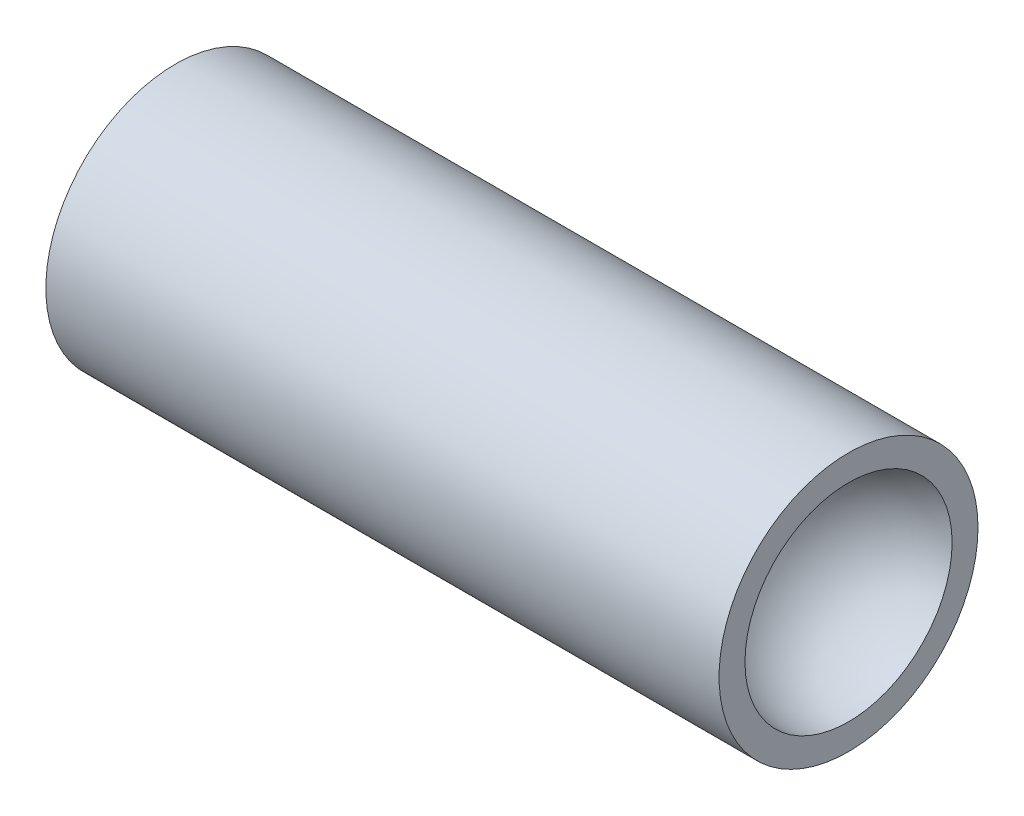
ISO-10303-21;
HEADER;
FILE_DESCRIPTION(('STEP AP214'),'2;1');
FILE_NAME('part.step','',(''),(''),'','','');
FILE_SCHEMA(('AUTOMOTIVE_DESIGN { 1 0 10303 214 1 1 1 1 }'));
ENDSEC;
DATA;
#1=APPLICATION_CONTEXT('core data for automotive mechanical design processes');
#2=APPLICATION_PROTOCOL_DEFINITION('international standard','automotive_design',2000,#1);
#3=PRODUCT_CONTEXT('',#1,'mechanical');
#4=PRODUCT('Part','Part','',(#3));
#5=PRODUCT_RELATED_PRODUCT_CATEGORY('part','',(#4));
#6=PRODUCT_DEFINITION_FORMATION('','',#4);
#7=PRODUCT_DEFINITION_CONTEXT('part definition',#1,'design');
#8=PRODUCT_DEFINITION('design','',#6,#7);
#9=PRODUCT_DEFINITION_SHAPE('','',#8);
#10=(LENGTH_UNIT() NAMED_UNIT(*) SI_UNIT(.MILLI.,.METRE.));
#11=(NAMED_UNIT(*) PLANE_ANGLE_UNIT() SI_UNIT($,.RADIAN.));
#12=(NAMED_UNIT(*) SI_UNIT($,.STERADIAN.) SOLID_ANGLE_UNIT());
#13=UNCERTAINTY_MEASURE_WITH_UNIT(LENGTH_MEASURE(1.E-05),#10,'distance_accuracy_value','');
#14=(GEOMETRIC_REPRESENTATION_CONTEXT(3) GLOBAL_UNCERTAINTY_ASSIGNED_CONTEXT((#13)) GLOBAL_UNIT_ASSIGNED_CONTEXT((#10,
#11,#12)) REPRESENTATION_CONTEXT('',''));
#15=CARTESIAN_POINT('',(0.,0.,0.));
#16=DIRECTION('',(0.,0.,1.));
#17=DIRECTION('',(1.,0.,0.));
#18=AXIS2_PLACEMENT_3D('',#15,#16,#17);
#19=CARTESIAN_POINT('',(130.,0.,0.));
#20=DIRECTION('',(-1.,0.,0.));
#21=DIRECTION('',(0.,0.,1.));
#22=AXIS2_PLACEMENT_3D('',#19,#20,#21);
#23=CYLINDRICAL_SURFACE('',#22,25.);
#24=CARTESIAN_POINT('',(130.,0.,0.));
#25=DIRECTION('',(1.,0.,0.));
#26=DIRECTION('',(0.,0.,-1.));
#27=AXIS2_PLACEMENT_3D('',#24,#25,#26);
#28=CIRCLE('',#27,25.);
#29=CARTESIAN_POINT('',(130.,0.,-25.));
#30=VERTEX_POINT('',#29);
#31=EDGE_CURVE('E10',#30,#30,#28,.T.);
#32=ORIENTED_EDGE('',*,*,#31,.F.);
#33=EDGE_LOOP('',(#32));
#34=FACE_BOUND('',#33,.T.);
#35=CARTESIAN_POINT('',(0.,0.,0.));
#36=DIRECTION('',(1.,0.,0.));
#37=DIRECTION('',(0.,0.,-1.));
#38=AXIS2_PLACEMENT_3D('',#35,#36,#37);
#39=CIRCLE('',#38,25.);
#40=CARTESIAN_POINT('',(0.,0.,-25.));
#41=VERTEX_POINT('',#40);
#42=EDGE_CURVE('E47',#41,#41,#39,.T.);
#43=ORIENTED_EDGE('',*,*,#42,.T.);
#44=EDGE_LOOP('',(#43));
#45=FACE_BOUND('',#44,.T.);
#46=ADVANCED_FACE('F39',(#34,#45),#23,.T.);
#47=CARTESIAN_POINT('',(130.,0.,0.));
#48=DIRECTION('',(1.,0.,0.));
#49=DIRECTION('',(0.,0.,-1.));
#50=AXIS2_PLACEMENT_3D('',#47,#48,#49);
#51=PLANE('',#50);
#52=CARTESIAN_POINT('',(130.,0.,0.));
#53=DIRECTION('',(1.,0.,0.));
#54=DIRECTION('',(0.,0.,-1.));
#55=AXIS2_PLACEMENT_3D('',#52,#53,#54);
#56=CIRCLE('',#55,20.);
#57=CARTESIAN_POINT('',(130.,0.,-20.));
#58=VERTEX_POINT('',#57);
#59=EDGE_CURVE('E42',#58,#58,#56,.T.);
#60=ORIENTED_EDGE('',*,*,#59,.F.);
#61=EDGE_LOOP('',(#60));
#62=FACE_BOUND('',#61,.T.);
#63=ORIENTED_EDGE('',*,*,#31,.T.);
#64=EDGE_LOOP('',(#63));
#65=FACE_BOUND('',#64,.T.);
#66=ADVANCED_FACE('F69',(#62,#65),#51,.T.);
#67=CARTESIAN_POINT('',(0.,0.,0.));
#68=DIRECTION('',(1.,0.,0.));
#69=DIRECTION('',(0.,0.,-1.));
#70=AXIS2_PLACEMENT_3D('',#67,#68,#69);
#71=PLANE('',#70);
#72=CARTESIAN_POINT('',(0.,0.,0.));
#73=DIRECTION('',(-1.,0.,0.));
#74=DIRECTION('',(0.,0.,1.));
#75=AXIS2_PLACEMENT_3D('',#72,#73,#74);
#76=CIRCLE('',#75,20.);
#77=CARTESIAN_POINT('',(0.,0.,20.));
#78=VERTEX_POINT('',#77);
#79=EDGE_CURVE('E54',#78,#78,#76,.T.);
#80=ORIENTED_EDGE('',*,*,#79,.F.);
#81=EDGE_LOOP('',(#80));
#82=FACE_BOUND('',#81,.T.);
#83=ORIENTED_EDGE('',*,*,#42,.F.);
#84=EDGE_LOOP('',(#83));
#85=FACE_BOUND('',#84,.T.);
#86=ADVANCED_FACE('F71',(#82,#85),#71,.F.);
#87=CARTESIAN_POINT('',(130.,0.,0.));
#88=DIRECTION('',(0.,0.,-1.));
#89=DIRECTION('',(0.,-1.,0.));
#90=AXIS2_PLACEMENT_3D('',#87,#88,#89);
#91=SPHERICAL_SURFACE('',#90,20.);
#92=CARTESIAN_POINT('',(130.,0.,0.));
#93=DIRECTION('',(1.,0.,0.));
#94=DIRECTION('',(0.,0.,-1.));
#95=AXIS2_PLACEMENT_3D('',#92,#93,#94);
#96=SPHERICAL_SURFACE('',#95,20.);
#97=ORIENTED_EDGE('',*,*,#59,.T.);
#98=EDGE_LOOP('',(#97));
#99=FACE_BOUND('',#98,.T.);
#100=ADVANCED_FACE('F67',(#99),#96,.F.);
#101=CARTESIAN_POINT('',(100.,0.,0.));
#102=DIRECTION('',(-1.,0.,0.));
#103=DIRECTION('',(0.,0.,1.));
#104=AXIS2_PLACEMENT_3D('',#101,#102,#103);
#105=CYLINDRICAL_SURFACE('',#104,20.);
#106=CARTESIAN_POINT('',(100.,0.,0.));
#107=DIRECTION('',(-1.,0.,0.));
#108=DIRECTION('',(0.,0.,1.));
#109=AXIS2_PLACEMENT_3D('',#106,#107,#108);
#110=CIRCLE('',#109,20.);
#111=CARTESIAN_POINT('',(100.,0.,20.));
#112=VERTEX_POINT('',#111);
#113=EDGE_CURVE('E58',#112,#112,#110,.T.);
#114=ORIENTED_EDGE('',*,*,#113,.F.);
#115=EDGE_LOOP('',(#114));
#116=FACE_BOUND('',#115,.T.);
#117=ORIENTED_EDGE('',*,*,#79,.T.);
#118=EDGE_LOOP('',(#117));
#119=FACE_BOUND('',#118,.T.);
#120=ADVANCED_FACE('F82',(#116,#119),#105,.F.);
#121=CARTESIAN_POINT('',(100.,0.,0.));
#122=DIRECTION('',(-1.,0.,0.));
#123=DIRECTION('',(0.,0.,1.));
#124=AXIS2_PLACEMENT_3D('',#121,#122,#123);
#125=PLANE('',#124);
#126=ORIENTED_EDGE('',*,*,#113,.T.);
#127=EDGE_LOOP('',(#126));
#128=FACE_BOUND('',#127,.T.);
#129=ADVANCED_FACE('F85',(#128),#125,.T.);
#130=CLOSED_SHELL('',(#46,#66,#86,#100,#120,#129));
#131=MANIFOLD_SOLID_BREP('B2',#130);
#132=ADVANCED_BREP_SHAPE_REPRESENTATION('',(#18,#131),#14);
#133=SHAPE_DEFINITION_REPRESENTATION(#9,#132);
ENDSEC;
END-ISO-10303-21;
